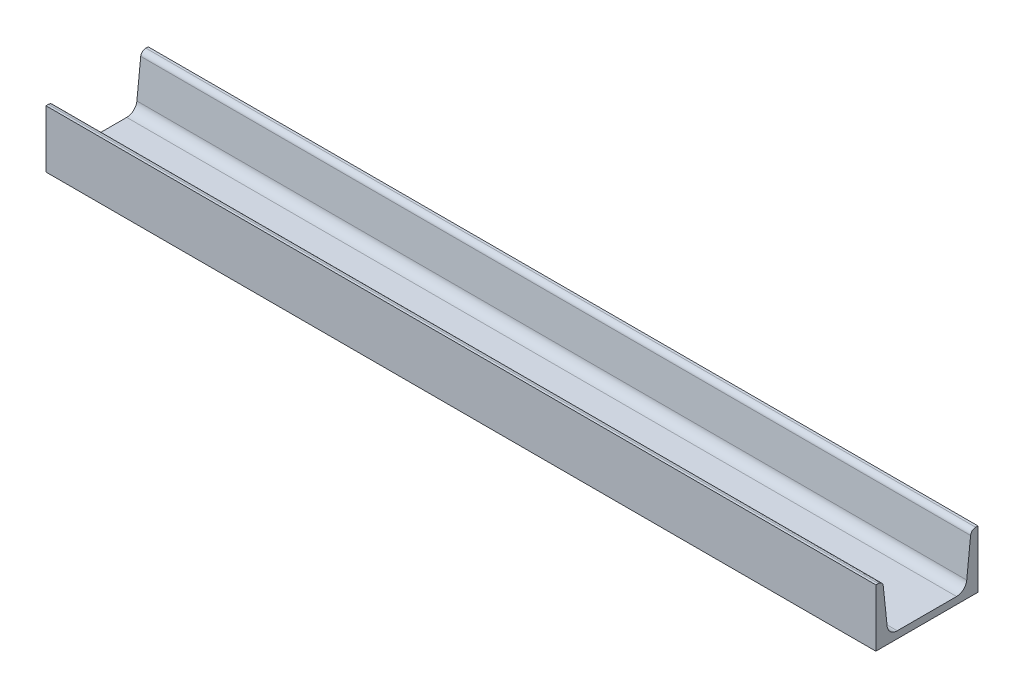
ISO-10303-21;
HEADER;
FILE_DESCRIPTION(('STEP AP214'),'2;1');
FILE_NAME('part.step','',(''),(''),'','','');
FILE_SCHEMA(('AUTOMOTIVE_DESIGN { 1 0 10303 214 1 1 1 1 }'));
ENDSEC;
DATA;
#1=APPLICATION_CONTEXT('core data for automotive mechanical design processes');
#2=APPLICATION_PROTOCOL_DEFINITION('international standard','automotive_design',2000,#1);
#3=PRODUCT_CONTEXT('',#1,'mechanical');
#4=PRODUCT('Part','Part','',(#3));
#5=PRODUCT_RELATED_PRODUCT_CATEGORY('part','',(#4));
#6=PRODUCT_DEFINITION_FORMATION('','',#4);
#7=PRODUCT_DEFINITION_CONTEXT('part definition',#1,'design');
#8=PRODUCT_DEFINITION('design','',#6,#7);
#9=PRODUCT_DEFINITION_SHAPE('','',#8);
#10=(LENGTH_UNIT() NAMED_UNIT(*) SI_UNIT(.MILLI.,.METRE.));
#11=(NAMED_UNIT(*) PLANE_ANGLE_UNIT() SI_UNIT($,.RADIAN.));
#12=(NAMED_UNIT(*) SI_UNIT($,.STERADIAN.) SOLID_ANGLE_UNIT());
#13=UNCERTAINTY_MEASURE_WITH_UNIT(LENGTH_MEASURE(1.E-05),#10,'distance_accuracy_value','');
#14=(GEOMETRIC_REPRESENTATION_CONTEXT(3) GLOBAL_UNCERTAINTY_ASSIGNED_CONTEXT((#13)) GLOBAL_UNIT_ASSIGNED_CONTEXT((#10,
#11,#12)) REPRESENTATION_CONTEXT('',''));
#15=CARTESIAN_POINT('',(0.,0.,0.));
#16=DIRECTION('',(0.,0.,1.));
#17=DIRECTION('',(1.,0.,0.));
#18=AXIS2_PLACEMENT_3D('',#15,#16,#17);
#19=CARTESIAN_POINT('',(650.,41.,78.1774248245681));
#20=DIRECTION('',(-1.,0.,0.));
#21=DIRECTION('',(0.,0.,1.));
#22=AXIS2_PLACEMENT_3D('',#19,#20,#21);
#23=CYLINDRICAL_SURFACE('',#22,4.00000000000001);
#24=CARTESIAN_POINT('',(0.,41.,78.1774248245681));
#25=DIRECTION('',(1.,0.,0.));
#26=DIRECTION('',(0.,0.,-1.));
#27=AXIS2_PLACEMENT_3D('',#24,#25,#26);
#28=CIRCLE('',#27,4.00000000000001);
#29=CARTESIAN_POINT('',(0.,41.4181138530706,74.199337243095));
#30=VERTEX_POINT('',#29);
#31=CARTESIAN_POINT('',(0.,45.,78.1774248245681));
#32=VERTEX_POINT('',#31);
#33=EDGE_CURVE('E205',#30,#32,#28,.T.);
#34=ORIENTED_EDGE('',*,*,#33,.T.);
#35=DIRECTION('',(-1.,0.,0.));
#36=VECTOR('',#35,1.);
#37=CARTESIAN_POINT('',(650.,45.,78.1774248245681));
#38=LINE('',#37,#36);
#39=CARTESIAN_POINT('',(650.,45.,78.1774248245681));
#40=VERTEX_POINT('',#39);
#41=EDGE_CURVE('E13',#40,#32,#38,.T.);
#42=ORIENTED_EDGE('',*,*,#41,.F.);
#43=CARTESIAN_POINT('',(650.,41.,78.1774248245681));
#44=DIRECTION('',(1.,0.,0.));
#45=DIRECTION('',(0.,0.,-1.));
#46=AXIS2_PLACEMENT_3D('',#43,#44,#45);
#47=CIRCLE('',#46,4.00000000000001);
#48=CARTESIAN_POINT('',(650.,41.4181138530706,74.199337243095));
#49=VERTEX_POINT('',#48);
#50=EDGE_CURVE('E239',#49,#40,#47,.T.);
#51=ORIENTED_EDGE('',*,*,#50,.F.);
#52=DIRECTION('',(-1.,0.,0.));
#53=VECTOR('',#52,1.);
#54=CARTESIAN_POINT('',(650.,41.4181138530706,74.199337243095));
#55=LINE('',#54,#53);
#56=EDGE_CURVE('E201',#49,#30,#55,.T.);
#57=ORIENTED_EDGE('',*,*,#56,.T.);
#58=EDGE_LOOP('',(#34,#42,#51,#57));
#59=FACE_BOUND('',#58,.T.);
#60=ADVANCED_FACE('F80',(#59),#23,.T.);
#61=CARTESIAN_POINT('',(650.,45.,80.));
#62=DIRECTION('',(0.,-1.,0.));
#63=DIRECTION('',(0.,0.,-1.));
#64=AXIS2_PLACEMENT_3D('',#61,#62,#63);
#65=PLANE('',#64);
#66=DIRECTION('',(0.,0.,1.));
#67=VECTOR('',#66,1.);
#68=CARTESIAN_POINT('',(0.,45.,80.));
#69=LINE('',#68,#67);
#70=CARTESIAN_POINT('',(0.,45.,80.));
#71=VERTEX_POINT('',#70);
#72=EDGE_CURVE('E209',#32,#71,#69,.T.);
#73=ORIENTED_EDGE('',*,*,#72,.T.);
#74=DIRECTION('',(-1.,0.,0.));
#75=VECTOR('',#74,1.);
#76=CARTESIAN_POINT('',(650.,45.,80.));
#77=LINE('',#76,#75);
#78=CARTESIAN_POINT('',(650.,45.,80.));
#79=VERTEX_POINT('',#78);
#80=EDGE_CURVE('E89',#79,#71,#77,.T.);
#81=ORIENTED_EDGE('',*,*,#80,.F.);
#82=DIRECTION('',(0.,0.,1.));
#83=VECTOR('',#82,1.);
#84=CARTESIAN_POINT('',(650.,45.,80.));
#85=LINE('',#84,#83);
#86=EDGE_CURVE('E152',#40,#79,#85,.T.);
#87=ORIENTED_EDGE('',*,*,#86,.F.);
#88=ORIENTED_EDGE('',*,*,#41,.T.);
#89=EDGE_LOOP('',(#73,#81,#87,#88));
#90=FACE_BOUND('',#89,.T.);
#91=ADVANCED_FACE('F333',(#90),#65,.F.);
#92=CARTESIAN_POINT('',(650.,45.,80.));
#93=DIRECTION('',(0.,0.,-1.));
#94=DIRECTION('',(0.,1.,0.));
#95=AXIS2_PLACEMENT_3D('',#92,#93,#94);
#96=PLANE('',#95);
#97=DIRECTION('',(0.,-1.,0.));
#98=VECTOR('',#97,1.);
#99=CARTESIAN_POINT('',(0.,45.,80.));
#100=LINE('',#99,#98);
#101=CARTESIAN_POINT('',(0.,0.,80.));
#102=VERTEX_POINT('',#101);
#103=EDGE_CURVE('E212',#71,#102,#100,.T.);
#104=ORIENTED_EDGE('',*,*,#103,.T.);
#105=DIRECTION('',(-1.,0.,0.));
#106=VECTOR('',#105,1.);
#107=CARTESIAN_POINT('',(650.,0.,80.));
#108=LINE('',#107,#106);
#109=CARTESIAN_POINT('',(650.,0.,80.));
#110=VERTEX_POINT('',#109);
#111=EDGE_CURVE('E266',#110,#102,#108,.T.);
#112=ORIENTED_EDGE('',*,*,#111,.F.);
#113=DIRECTION('',(0.,-1.,0.));
#114=VECTOR('',#113,1.);
#115=CARTESIAN_POINT('',(650.,45.,80.));
#116=LINE('',#115,#114);
#117=EDGE_CURVE('E276',#79,#110,#116,.T.);
#118=ORIENTED_EDGE('',*,*,#117,.F.);
#119=ORIENTED_EDGE('',*,*,#80,.T.);
#120=EDGE_LOOP('',(#104,#112,#118,#119));
#121=FACE_BOUND('',#120,.T.);
#122=ADVANCED_FACE('F274',(#121),#96,.F.);
#123=CARTESIAN_POINT('',(650.,0.,80.));
#124=DIRECTION('',(0.,1.,0.));
#125=DIRECTION('',(0.,0.,1.));
#126=AXIS2_PLACEMENT_3D('',#123,#124,#125);
#127=PLANE('',#126);
#128=DIRECTION('',(0.,0.,-1.));
#129=VECTOR('',#128,1.);
#130=CARTESIAN_POINT('',(0.,0.,80.));
#131=LINE('',#130,#129);
#132=CARTESIAN_POINT('',(0.,0.,0.));
#133=VERTEX_POINT('',#132);
#134=EDGE_CURVE('E215',#102,#133,#131,.T.);
#135=ORIENTED_EDGE('',*,*,#134,.T.);
#136=DIRECTION('',(-1.,0.,0.));
#137=VECTOR('',#136,1.);
#138=CARTESIAN_POINT('',(650.,0.,0.));
#139=LINE('',#138,#137);
#140=CARTESIAN_POINT('',(650.,0.,0.));
#141=VERTEX_POINT('',#140);
#142=EDGE_CURVE('E262',#141,#133,#139,.T.);
#143=ORIENTED_EDGE('',*,*,#142,.F.);
#144=DIRECTION('',(0.,0.,-1.));
#145=VECTOR('',#144,1.);
#146=CARTESIAN_POINT('',(650.,0.,80.));
#147=LINE('',#146,#145);
#148=EDGE_CURVE('E295',#110,#141,#147,.T.);
#149=ORIENTED_EDGE('',*,*,#148,.F.);
#150=ORIENTED_EDGE('',*,*,#111,.T.);
#151=EDGE_LOOP('',(#135,#143,#149,#150));
#152=FACE_BOUND('',#151,.T.);
#153=ADVANCED_FACE('F285',(#152),#127,.F.);
#154=CARTESIAN_POINT('',(650.,45.,0.));
#155=DIRECTION('',(0.,0.,1.));
#156=DIRECTION('',(1.,0.,0.));
#157=AXIS2_PLACEMENT_3D('',#154,#155,#156);
#158=PLANE('',#157);
#159=DIRECTION('',(0.,1.,0.));
#160=VECTOR('',#159,1.);
#161=CARTESIAN_POINT('',(0.,45.,0.));
#162=LINE('',#161,#160);
#163=CARTESIAN_POINT('',(0.,45.,0.));
#164=VERTEX_POINT('',#163);
#165=EDGE_CURVE('E218',#133,#164,#162,.T.);
#166=ORIENTED_EDGE('',*,*,#165,.T.);
#167=DIRECTION('',(-1.,0.,0.));
#168=VECTOR('',#167,1.);
#169=CARTESIAN_POINT('',(650.,45.,0.));
#170=LINE('',#169,#168);
#171=CARTESIAN_POINT('',(650.,45.,0.));
#172=VERTEX_POINT('',#171);
#173=EDGE_CURVE('E258',#172,#164,#170,.T.);
#174=ORIENTED_EDGE('',*,*,#173,.F.);
#175=DIRECTION('',(0.,1.,0.));
#176=VECTOR('',#175,1.);
#177=CARTESIAN_POINT('',(650.,45.,0.));
#178=LINE('',#177,#176);
#179=EDGE_CURVE('E291',#141,#172,#178,.T.);
#180=ORIENTED_EDGE('',*,*,#179,.F.);
#181=ORIENTED_EDGE('',*,*,#142,.T.);
#182=EDGE_LOOP('',(#166,#174,#180,#181));
#183=FACE_BOUND('',#182,.T.);
#184=ADVANCED_FACE('F289',(#183),#158,.F.);
#185=CARTESIAN_POINT('',(650.,45.,0.));
#186=DIRECTION('',(0.,-1.,0.));
#187=DIRECTION('',(0.,0.,-1.));
#188=AXIS2_PLACEMENT_3D('',#185,#186,#187);
#189=PLANE('',#188);
#190=DIRECTION('',(0.,0.,1.));
#191=VECTOR('',#190,1.);
#192=CARTESIAN_POINT('',(0.,45.,0.));
#193=LINE('',#192,#191);
#194=CARTESIAN_POINT('',(0.,45.,1.8225751754319));
#195=VERTEX_POINT('',#194);
#196=EDGE_CURVE('E221',#164,#195,#193,.T.);
#197=ORIENTED_EDGE('',*,*,#196,.T.);
#198=DIRECTION('',(-1.,0.,0.));
#199=VECTOR('',#198,1.);
#200=CARTESIAN_POINT('',(650.,45.,1.8225751754319));
#201=LINE('',#200,#199);
#202=CARTESIAN_POINT('',(650.,45.,1.8225751754319));
#203=VERTEX_POINT('',#202);
#204=EDGE_CURVE('E254',#203,#195,#201,.T.);
#205=ORIENTED_EDGE('',*,*,#204,.F.);
#206=DIRECTION('',(0.,0.,1.));
#207=VECTOR('',#206,1.);
#208=CARTESIAN_POINT('',(650.,45.,0.));
#209=LINE('',#208,#207);
#210=EDGE_CURVE('E294',#172,#203,#209,.T.);
#211=ORIENTED_EDGE('',*,*,#210,.F.);
#212=ORIENTED_EDGE('',*,*,#173,.T.);
#213=EDGE_LOOP('',(#197,#205,#211,#212));
#214=FACE_BOUND('',#213,.T.);
#215=ADVANCED_FACE('F346',(#214),#189,.F.);
#216=CARTESIAN_POINT('',(650.,41.,1.8225751754319));
#217=DIRECTION('',(-1.,0.,0.));
#218=DIRECTION('',(0.,0.,1.));
#219=AXIS2_PLACEMENT_3D('',#216,#217,#218);
#220=CYLINDRICAL_SURFACE('',#219,4.);
#221=CARTESIAN_POINT('',(0.,41.,1.8225751754319));
#222=DIRECTION('',(1.,0.,0.));
#223=DIRECTION('',(0.,0.,1.));
#224=AXIS2_PLACEMENT_3D('',#221,#222,#223);
#225=CIRCLE('',#224,4.);
#226=CARTESIAN_POINT('',(0.,41.4181138530706,5.800662756905));
#227=VERTEX_POINT('',#226);
#228=EDGE_CURVE('E224',#195,#227,#225,.T.);
#229=ORIENTED_EDGE('',*,*,#228,.T.);
#230=DIRECTION('',(-1.,0.,0.));
#231=VECTOR('',#230,1.);
#232=CARTESIAN_POINT('',(650.,41.4181138530706,5.800662756905));
#233=LINE('',#232,#231);
#234=CARTESIAN_POINT('',(650.,41.4181138530706,5.800662756905));
#235=VERTEX_POINT('',#234);
#236=EDGE_CURVE('E250',#235,#227,#233,.T.);
#237=ORIENTED_EDGE('',*,*,#236,.F.);
#238=CARTESIAN_POINT('',(650.,41.,1.8225751754319));
#239=DIRECTION('',(1.,0.,0.));
#240=DIRECTION('',(0.,0.,1.));
#241=AXIS2_PLACEMENT_3D('',#238,#239,#240);
#242=CIRCLE('',#241,4.);
#243=EDGE_CURVE('E299',#203,#235,#242,.T.);
#244=ORIENTED_EDGE('',*,*,#243,.F.);
#245=ORIENTED_EDGE('',*,*,#204,.T.);
#246=EDGE_LOOP('',(#229,#237,#244,#245));
#247=FACE_BOUND('',#246,.T.);
#248=ADVANCED_FACE('F349',(#247),#220,.T.);
#249=CARTESIAN_POINT('',(650.,12.6637722938588,8.82286583705383));
#250=DIRECTION('',(0.,-0.104528463267647,-0.994521895368274));
#251=DIRECTION('',(0.,0.994521895368274,-0.104528463267647));
#252=AXIS2_PLACEMENT_3D('',#249,#250,#251);
#253=PLANE('',#252);
#254=DIRECTION('',(0.,-0.994521895368274,0.104528463267647));
#255=VECTOR('',#254,1.);
#256=CARTESIAN_POINT('',(0.,12.6637722938588,8.82286583705383));
#257=LINE('',#256,#255);
#258=CARTESIAN_POINT('',(0.,12.6637722938588,8.82286583705383));
#259=VERTEX_POINT('',#258);
#260=EDGE_CURVE('E227',#227,#259,#257,.T.);
#261=ORIENTED_EDGE('',*,*,#260,.T.);
#262=DIRECTION('',(-1.,0.,0.));
#263=VECTOR('',#262,1.);
#264=CARTESIAN_POINT('',(650.,12.6637722938588,8.82286583705383));
#265=LINE('',#264,#263);
#266=CARTESIAN_POINT('',(650.,12.6637722938588,8.82286583705383));
#267=VERTEX_POINT('',#266);
#268=EDGE_CURVE('E246',#267,#259,#265,.T.);
#269=ORIENTED_EDGE('',*,*,#268,.F.);
#270=DIRECTION('',(0.,-0.994521895368274,0.104528463267647));
#271=VECTOR('',#270,1.);
#272=CARTESIAN_POINT('',(650.,12.6637722938588,8.82286583705383));
#273=LINE('',#272,#271);
#274=EDGE_CURVE('E306',#235,#267,#273,.T.);
#275=ORIENTED_EDGE('',*,*,#274,.F.);
#276=ORIENTED_EDGE('',*,*,#236,.T.);
#277=EDGE_LOOP('',(#261,#269,#275,#276));
#278=FACE_BOUND('',#277,.T.);
#279=ADVANCED_FACE('F314',(#278),#253,.F.);
#280=CARTESIAN_POINT('',(650.,13.5,16.779041));
#281=DIRECTION('',(-1.,0.,0.));
#282=DIRECTION('',(0.,0.,1.));
#283=AXIS2_PLACEMENT_3D('',#280,#281,#282);
#284=CYLINDRICAL_SURFACE('',#283,8.);
#285=CARTESIAN_POINT('',(0.,13.5,16.779041));
#286=DIRECTION('',(-1.,0.,0.));
#287=DIRECTION('',(0.,0.,-1.));
#288=AXIS2_PLACEMENT_3D('',#285,#286,#287);
#289=CIRCLE('',#288,8.);
#290=CARTESIAN_POINT('',(0.,5.50000000000001,16.779041));
#291=VERTEX_POINT('',#290);
#292=EDGE_CURVE('E230',#259,#291,#289,.T.);
#293=ORIENTED_EDGE('',*,*,#292,.T.);
#294=DIRECTION('',(-1.,0.,0.));
#295=VECTOR('',#294,1.);
#296=CARTESIAN_POINT('',(650.,5.50000000000001,16.779041));
#297=LINE('',#296,#295);
#298=CARTESIAN_POINT('',(650.,5.50000000000001,16.779041));
#299=VERTEX_POINT('',#298);
#300=EDGE_CURVE('E194',#299,#291,#297,.T.);
#301=ORIENTED_EDGE('',*,*,#300,.F.);
#302=CARTESIAN_POINT('',(650.,13.5,16.779041));
#303=DIRECTION('',(-1.,0.,0.));
#304=DIRECTION('',(0.,0.,-1.));
#305=AXIS2_PLACEMENT_3D('',#302,#303,#304);
#306=CIRCLE('',#305,8.);
#307=EDGE_CURVE('E183',#267,#299,#306,.T.);
#308=ORIENTED_EDGE('',*,*,#307,.F.);
#309=ORIENTED_EDGE('',*,*,#268,.T.);
#310=EDGE_LOOP('',(#293,#301,#308,#309));
#311=FACE_BOUND('',#310,.T.);
#312=ADVANCED_FACE('F318',(#311),#284,.F.);
#313=CARTESIAN_POINT('',(650.,5.5,63.220959));
#314=DIRECTION('',(0.,-1.,0.));
#315=DIRECTION('',(0.,0.,-1.));
#316=AXIS2_PLACEMENT_3D('',#313,#314,#315);
#317=PLANE('',#316);
#318=DIRECTION('',(0.,0.,1.));
#319=VECTOR('',#318,1.);
#320=CARTESIAN_POINT('',(0.,5.5,63.220959));
#321=LINE('',#320,#319);
#322=CARTESIAN_POINT('',(0.,5.5,63.220959));
#323=VERTEX_POINT('',#322);
#324=EDGE_CURVE('E192',#291,#323,#321,.T.);
#325=ORIENTED_EDGE('',*,*,#324,.T.);
#326=DIRECTION('',(-1.,0.,0.));
#327=VECTOR('',#326,1.);
#328=CARTESIAN_POINT('',(650.,5.5,63.220959));
#329=LINE('',#328,#327);
#330=CARTESIAN_POINT('',(650.,5.5,63.220959));
#331=VERTEX_POINT('',#330);
#332=EDGE_CURVE('E189',#331,#323,#329,.T.);
#333=ORIENTED_EDGE('',*,*,#332,.F.);
#334=DIRECTION('',(0.,0.,1.));
#335=VECTOR('',#334,1.);
#336=CARTESIAN_POINT('',(650.,5.5,63.220959));
#337=LINE('',#336,#335);
#338=EDGE_CURVE('E177',#299,#331,#337,.T.);
#339=ORIENTED_EDGE('',*,*,#338,.F.);
#340=ORIENTED_EDGE('',*,*,#300,.T.);
#341=EDGE_LOOP('',(#325,#333,#339,#340));
#342=FACE_BOUND('',#341,.T.);
#343=ADVANCED_FACE('F190',(#342),#317,.F.);
#344=CARTESIAN_POINT('',(650.,13.5,63.220959));
#345=DIRECTION('',(-1.,0.,0.));
#346=DIRECTION('',(0.,0.,1.));
#347=AXIS2_PLACEMENT_3D('',#344,#345,#346);
#348=CYLINDRICAL_SURFACE('',#347,8.);
#349=CARTESIAN_POINT('',(0.,13.5,63.220959));
#350=DIRECTION('',(-1.,0.,0.));
#351=DIRECTION('',(0.,0.,1.));
#352=AXIS2_PLACEMENT_3D('',#349,#350,#351);
#353=CIRCLE('',#352,8.);
#354=CARTESIAN_POINT('',(0.,12.6637722938588,71.1771341629462));
#355=VERTEX_POINT('',#354);
#356=EDGE_CURVE('E138',#323,#355,#353,.T.);
#357=ORIENTED_EDGE('',*,*,#356,.T.);
#358=DIRECTION('',(-1.,0.,0.));
#359=VECTOR('',#358,1.);
#360=CARTESIAN_POINT('',(650.,12.6637722938588,71.1771341629462));
#361=LINE('',#360,#359);
#362=CARTESIAN_POINT('',(650.,12.6637722938588,71.1771341629462));
#363=VERTEX_POINT('',#362);
#364=EDGE_CURVE('E195',#363,#355,#361,.T.);
#365=ORIENTED_EDGE('',*,*,#364,.F.);
#366=CARTESIAN_POINT('',(650.,13.5,63.220959));
#367=DIRECTION('',(-1.,0.,0.));
#368=DIRECTION('',(0.,0.,1.));
#369=AXIS2_PLACEMENT_3D('',#366,#367,#368);
#370=CIRCLE('',#369,8.);
#371=EDGE_CURVE('E181',#331,#363,#370,.T.);
#372=ORIENTED_EDGE('',*,*,#371,.F.);
#373=ORIENTED_EDGE('',*,*,#332,.T.);
#374=EDGE_LOOP('',(#357,#365,#372,#373));
#375=FACE_BOUND('',#374,.T.);
#376=ADVANCED_FACE('F197',(#375),#348,.F.);
#377=CARTESIAN_POINT('',(650.,12.6637722938588,71.1771341629462));
#378=DIRECTION('',(0.,-0.104528463267646,0.994521895368274));
#379=DIRECTION('',(0.,-0.994521895368274,-0.104528463267646));
#380=AXIS2_PLACEMENT_3D('',#377,#378,#379);
#381=PLANE('',#380);
#382=DIRECTION('',(0.,0.994521895368274,0.104528463267646));
#383=VECTOR('',#382,1.);
#384=CARTESIAN_POINT('',(0.,12.6637722938588,71.1771341629462));
#385=LINE('',#384,#383);
#386=EDGE_CURVE('E144',#355,#30,#385,.T.);
#387=ORIENTED_EDGE('',*,*,#386,.T.);
#388=ORIENTED_EDGE('',*,*,#56,.F.);
#389=DIRECTION('',(0.,0.994521895368274,0.104528463267646));
#390=VECTOR('',#389,1.);
#391=CARTESIAN_POINT('',(650.,12.6637722938588,71.1771341629462));
#392=LINE('',#391,#390);
#393=EDGE_CURVE('E97',#363,#49,#392,.T.);
#394=ORIENTED_EDGE('',*,*,#393,.F.);
#395=ORIENTED_EDGE('',*,*,#364,.T.);
#396=EDGE_LOOP('',(#387,#388,#394,#395));
#397=FACE_BOUND('',#396,.T.);
#398=ADVANCED_FACE('F322',(#397),#381,.F.);
#399=CARTESIAN_POINT('',(650.,41.,78.1774248245681));
#400=DIRECTION('',(1.,0.,0.));
#401=DIRECTION('',(0.,0.,-1.));
#402=AXIS2_PLACEMENT_3D('',#399,#400,#401);
#403=PLANE('',#402);
#404=ORIENTED_EDGE('',*,*,#50,.T.);
#405=ORIENTED_EDGE('',*,*,#86,.T.);
#406=ORIENTED_EDGE('',*,*,#117,.T.);
#407=ORIENTED_EDGE('',*,*,#148,.T.);
#408=ORIENTED_EDGE('',*,*,#179,.T.);
#409=ORIENTED_EDGE('',*,*,#210,.T.);
#410=ORIENTED_EDGE('',*,*,#243,.T.);
#411=ORIENTED_EDGE('',*,*,#274,.T.);
#412=ORIENTED_EDGE('',*,*,#307,.T.);
#413=ORIENTED_EDGE('',*,*,#338,.T.);
#414=ORIENTED_EDGE('',*,*,#371,.T.);
#415=ORIENTED_EDGE('',*,*,#393,.T.);
#416=EDGE_LOOP('',(#404,#405,#406,#407,#408,#409,#410,#411,#412,#413,#414,#415));
#417=FACE_BOUND('',#416,.T.);
#418=ADVANCED_FACE('F179',(#417),#403,.T.);
#419=CARTESIAN_POINT('',(0.,41.,78.1774248245681));
#420=DIRECTION('',(1.,0.,0.));
#421=DIRECTION('',(0.,0.,-1.));
#422=AXIS2_PLACEMENT_3D('',#419,#420,#421);
#423=PLANE('',#422);
#424=ORIENTED_EDGE('',*,*,#33,.F.);
#425=ORIENTED_EDGE('',*,*,#386,.F.);
#426=ORIENTED_EDGE('',*,*,#356,.F.);
#427=ORIENTED_EDGE('',*,*,#324,.F.);
#428=ORIENTED_EDGE('',*,*,#292,.F.);
#429=ORIENTED_EDGE('',*,*,#260,.F.);
#430=ORIENTED_EDGE('',*,*,#228,.F.);
#431=ORIENTED_EDGE('',*,*,#196,.F.);
#432=ORIENTED_EDGE('',*,*,#165,.F.);
#433=ORIENTED_EDGE('',*,*,#134,.F.);
#434=ORIENTED_EDGE('',*,*,#103,.F.);
#435=ORIENTED_EDGE('',*,*,#72,.F.);
#436=EDGE_LOOP('',(#424,#425,#426,#427,#428,#429,#430,#431,#432,#433,#434,#435));
#437=FACE_BOUND('',#436,.T.);
#438=ADVANCED_FACE('F280',(#437),#423,.F.);
#439=CLOSED_SHELL('',(#60,#91,#122,#153,#184,#215,#248,#279,#312,#343,#376,#398,#418,#438));
#440=MANIFOLD_SOLID_BREP('B2',#439);
#441=ADVANCED_BREP_SHAPE_REPRESENTATION('',(#18,#440),#14);
#442=SHAPE_DEFINITION_REPRESENTATION(#9,#441);
ENDSEC;
END-ISO-10303-21;
